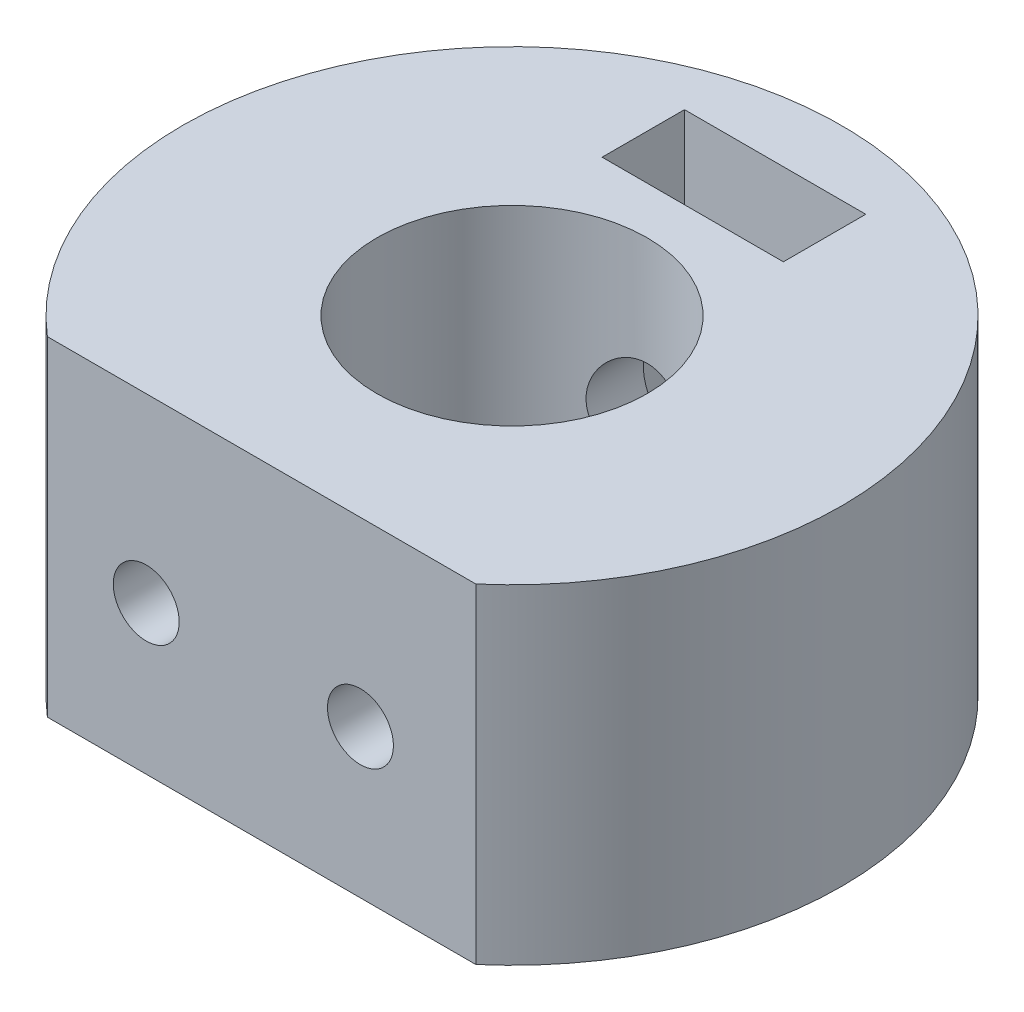
ISO-10303-21;
HEADER;
FILE_DESCRIPTION(('STEP AP214'),'2;1');
FILE_NAME('part.step','',(''),(''),'','','');
FILE_SCHEMA(('AUTOMOTIVE_DESIGN { 1 0 10303 214 1 1 1 1 }'));
ENDSEC;
DATA;
#1=APPLICATION_CONTEXT('core data for automotive mechanical design processes');
#2=APPLICATION_PROTOCOL_DEFINITION('international standard','automotive_design',2000,#1);
#3=PRODUCT_CONTEXT('',#1,'mechanical');
#4=PRODUCT('Part','Part','',(#3));
#5=PRODUCT_RELATED_PRODUCT_CATEGORY('part','',(#4));
#6=PRODUCT_DEFINITION_FORMATION('','',#4);
#7=PRODUCT_DEFINITION_CONTEXT('part definition',#1,'design');
#8=PRODUCT_DEFINITION('design','',#6,#7);
#9=PRODUCT_DEFINITION_SHAPE('','',#8);
#10=(LENGTH_UNIT() NAMED_UNIT(*) SI_UNIT(.MILLI.,.METRE.));
#11=(NAMED_UNIT(*) PLANE_ANGLE_UNIT() SI_UNIT($,.RADIAN.));
#12=(NAMED_UNIT(*) SI_UNIT($,.STERADIAN.) SOLID_ANGLE_UNIT());
#13=UNCERTAINTY_MEASURE_WITH_UNIT(LENGTH_MEASURE(1.E-05),#10,'distance_accuracy_value','');
#14=(GEOMETRIC_REPRESENTATION_CONTEXT(3) GLOBAL_UNCERTAINTY_ASSIGNED_CONTEXT((#13)) GLOBAL_UNIT_ASSIGNED_CONTEXT((#10,
#11,#12)) REPRESENTATION_CONTEXT('',''));
#15=CARTESIAN_POINT('',(0.,0.,0.));
#16=DIRECTION('',(0.,0.,1.));
#17=DIRECTION('',(1.,0.,0.));
#18=AXIS2_PLACEMENT_3D('',#15,#16,#17);
#19=CARTESIAN_POINT('',(0.,5.14875600466311,-13.4006579232147));
#20=DIRECTION('',(0.,0.,1.));
#21=DIRECTION('',(1.,0.,0.));
#22=AXIS2_PLACEMENT_3D('',#19,#20,#21);
#23=CYLINDRICAL_SURFACE('',#22,1.55);
#24=CARTESIAN_POINT('',(0.,5.14875600466311,-8.03281601617198));
#25=DIRECTION('',(0.,0.,-1.));
#26=DIRECTION('',(-1.,0.,0.));
#27=AXIS2_PLACEMENT_3D('',#24,#25,#26);
#28=CIRCLE('',#27,1.55);
#29=CARTESIAN_POINT('',(-1.55,5.14875600466311,-8.03281601617198));
#30=VERTEX_POINT('',#29);
#31=EDGE_CURVE('E44',#30,#30,#28,.F.);
#32=ORIENTED_EDGE('',*,*,#31,.T.);
#33=EDGE_LOOP('',(#32));
#34=FACE_BOUND('',#33,.T.);
#35=CARTESIAN_POINT('',(1.55,5.14875600466311,-9.87914469982093));
#36=CARTESIAN_POINT('',(1.54999645362467,5.2352572468877,-9.87914618258458));
#37=CARTESIAN_POINT('',(1.54273440811201,5.32180784284973,-9.88029309959836));
#38=CARTESIAN_POINT('',(1.51388723108366,5.49248668909826,-9.88475342739521));
#39=CARTESIAN_POINT('',(1.49228834940777,5.57661253295759,-9.88806891796722));
#40=CARTESIAN_POINT('',(1.43543134968755,5.73994676257797,-9.89648205929217));
#41=CARTESIAN_POINT('',(1.4001839837598,5.81915896240165,-9.90157830687782));
#42=CARTESIAN_POINT('',(1.31705631616549,5.97053438714797,-9.91297707939274));
#43=CARTESIAN_POINT('',(1.26917766145408,6.04269852936573,-9.91927944703031));
#44=CARTESIAN_POINT('',(1.16170996479098,6.17855612784661,-9.93244051349818));
#45=CARTESIAN_POINT('',(1.10203425146943,6.24218065703729,-9.93930309477636));
#46=CARTESIAN_POINT('',(0.972853616883496,6.35855525235113,-9.952776744639));
#47=CARTESIAN_POINT('',(0.903348143600153,6.41130470734348,-9.95938779907177));
#48=CARTESIAN_POINT('',(0.756037913891268,6.50468741515583,-9.97165427023862));
#49=CARTESIAN_POINT('',(0.678192333236602,6.54525699337116,-9.97730460003385));
#50=CARTESIAN_POINT('',(0.516689603151229,6.61271951638521,-9.98696992123528));
#51=CARTESIAN_POINT('',(0.433032781493103,6.63961323183558,-9.99098500478707));
#52=CARTESIAN_POINT('',(0.262992845212545,6.6787511107006,-9.99690004710837));
#53=CARTESIAN_POINT('',(0.176636914652342,6.69111081817643,-9.99881667984015));
#54=CARTESIAN_POINT('',(0.00305704492002859,6.70118875752582,-10.0003760558984));
#55=CARTESIAN_POINT('',(-0.0841668425817511,6.69890785582426,-10.0000189337847));
#56=CARTESIAN_POINT('',(-0.256217859315106,6.67986019519255,-9.99708432494727));
#57=CARTESIAN_POINT('',(-0.34105912308796,6.66321775519231,-9.99452589414396));
#58=CARTESIAN_POINT('',(-0.506730060242721,6.61611475521437,-9.98749736431911));
#59=CARTESIAN_POINT('',(-0.587559624683682,6.58565382021178,-9.98302721341493));
#60=CARTESIAN_POINT('',(-0.743287090078505,6.5116523144962,-9.97264484174725));
#61=CARTESIAN_POINT('',(-0.818159877371788,6.46805972975526,-9.96672690419278));
#62=CARTESIAN_POINT('',(-0.959574622311767,6.3690703707002,-9.95410791898241));
#63=CARTESIAN_POINT('',(-1.02611599451366,6.31367276759095,-9.94740681635775));
#64=CARTESIAN_POINT('',(-1.14971236200862,6.19195422311961,-9.93388518275012));
#65=CARTESIAN_POINT('',(-1.20666042688608,6.12552470570579,-9.92706413654105));
#66=CARTESIAN_POINT('',(-1.30861776831814,5.98399602344785,-9.91413984926771));
#67=CARTESIAN_POINT('',(-1.35362696158088,5.90889679812451,-9.90803661321142));
#68=CARTESIAN_POINT('',(-1.43044525434669,5.75204540778367,-9.89723899484108));
#69=CARTESIAN_POINT('',(-1.46224281880505,5.67028750325234,-9.89254584465548));
#70=CARTESIAN_POINT('',(-1.51162477600527,5.50250247834193,-9.88512114472347));
#71=CARTESIAN_POINT('',(-1.52921024202027,5.41647568086316,-9.88238944685331));
#72=CARTESIAN_POINT('',(-1.54952103194361,5.24354778277445,-9.87922520684305));
#73=CARTESIAN_POINT('',(-1.55239818229468,5.15666492971882,-9.87876917533567));
#74=CARTESIAN_POINT('',(-1.5436140348358,4.98365817603287,-9.88014548032674));
#75=CARTESIAN_POINT('',(-1.53195321986441,4.89753425029252,-9.88197774082587));
#76=CARTESIAN_POINT('',(-1.4945531172252,4.72896390024374,-9.88770256652683));
#77=CARTESIAN_POINT('',(-1.46888994441598,4.64650017697418,-9.89158398910683));
#78=CARTESIAN_POINT('',(-1.40429297402282,4.48704451438445,-9.90096056499129));
#79=CARTESIAN_POINT('',(-1.36535848045129,4.41005286229194,-9.90645580292693));
#80=CARTESIAN_POINT('',(-1.27496116413507,4.26304766874283,-9.91849595445214));
#81=CARTESIAN_POINT('',(-1.223400345055,4.1930950600248,-9.9250489348761));
#82=CARTESIAN_POINT('',(-1.10934972840317,4.06278106235098,-9.93844212530365));
#83=CARTESIAN_POINT('',(-1.04685926951799,4.00242025418278,-9.94528235266849));
#84=CARTESIAN_POINT('',(-0.912053439030084,3.89245537345001,-9.95855298637438));
#85=CARTESIAN_POINT('',(-0.839655364514436,3.84295210370248,-9.9649791906104));
#86=CARTESIAN_POINT('',(-0.687482592609691,3.75681090692998,-9.97663181910408));
#87=CARTESIAN_POINT('',(-0.607708108105855,3.72017260876463,-9.98185827797157));
#88=CARTESIAN_POINT('',(-0.443357310318089,3.66096123461213,-9.99050416705174));
#89=CARTESIAN_POINT('',(-0.35880098916595,3.63833373038743,-9.99393058199128));
#90=CARTESIAN_POINT('',(-0.187031586806194,3.60761035421945,-9.99861970055578));
#91=CARTESIAN_POINT('',(-0.0998186939365643,3.59951345455431,-9.99988255720478));
#92=CARTESIAN_POINT('',(0.0738119096710888,3.59810751347846,-10.0001005540474));
#93=CARTESIAN_POINT('',(0.160228382638927,3.60464448866457,-9.99907972416941));
#94=CARTESIAN_POINT('',(0.330717287739155,3.63198981177826,-9.99489367655891));
#95=CARTESIAN_POINT('',(0.414789728900719,3.65279810472504,-9.99172846708774));
#96=CARTESIAN_POINT('',(0.578156970890536,3.70803944949415,-9.98360774650382));
#97=CARTESIAN_POINT('',(0.65745569556334,3.7424611303638,-9.97865372984063));
#98=CARTESIAN_POINT('',(0.809176140334791,3.82393552841412,-9.96749855728621));
#99=CARTESIAN_POINT('',(0.881597606814705,3.87098871117316,-9.96129735542771));
#100=CARTESIAN_POINT('',(1.01828727585299,3.97694411598674,-9.94825909484418));
#101=CARTESIAN_POINT('',(1.08246701171539,4.03595977297811,-9.94141631410424));
#102=CARTESIAN_POINT('',(1.20006782704092,4.16392626636541,-9.92790764809064));
#103=CARTESIAN_POINT('',(1.25348638044348,4.23287942897252,-9.92124180466901));
#104=CARTESIAN_POINT('',(1.3483398600277,4.37925413215469,-9.90879854789034));
#105=CARTESIAN_POINT('',(1.38970057938335,4.45672423178943,-9.9030267343887));
#106=CARTESIAN_POINT('',(1.45876032395204,4.61756641301018,-9.89309082740896));
#107=CARTESIAN_POINT('',(1.48647337433063,4.70093233448287,-9.88892508439638));
#108=CARTESIAN_POINT('',(1.52123960848718,4.84534157516954,-9.88362431840115));
#109=CARTESIAN_POINT('',(1.53200802407374,4.90549781795901,-9.8819534923846));
#110=CARTESIAN_POINT('',(1.54638941992366,5.02667985573188,-9.87971316775383));
#111=CARTESIAN_POINT('',(1.55000250294109,5.08770563821559,-9.87914365332424));
#112=CARTESIAN_POINT('',(1.55,5.14875600466311,-9.87914469982093));
#113=B_SPLINE_CURVE_WITH_KNOTS('',3,(#35,#36,#37,#38,#39,#40,#41,#42,#43,#44,#45,#46,#47,#48,
#49,#50,#51,#52,#53,#54,#55,#56,#57,#58,#59,#60,#61,#62,#63,#64,#65,#66,#67,#68,#69,#70,#71,#72,
#73,#74,#75,#76,#77,#78,#79,#80,#81,#82,#83,#84,#85,#86,#87,#88,#89,#90,#91,#92,#93,#94,#95,#96,
#97,#98,#99,#100,#101,#102,#103,#104,#105,#106,#107,#108,#109,#110,#111,#112),.UNSPECIFIED.,.T.,
.F.,(4,2,2,2,2,2,2,2,2,2,2,2,2,2,2,2,2,2,2,2,2,2,2,2,2,2,2,2,2,2,2,2,2,2,2,2,2,2,4),(0.,
0.259280551263236,0.518810133084237,0.778135675127696,1.03742742120275,1.29870012478935,
1.55998750674059,1.82261798233181,2.08523365673306,2.34574713427059,2.60624519487594,
2.86451065056895,3.1227831158366,3.38209235042215,3.64141979633706,3.90346987715576,
4.16552178612573,4.42780201369479,4.69006243246257,4.94961012446835,5.20914919654077,
5.46729130594808,5.72544695517981,5.98567352057418,6.24591583679814,6.50848061500321,
6.77103781787888,7.03256854883183,7.29408078148741,7.55285422762531,7.81162667683424,
8.07018343427809,8.32874972304823,8.58989337607068,8.85109825823607,9.11387827218121,
9.37638767109772,9.55938388687224,9.7423774747127),.UNSPECIFIED.);
#114=CARTESIAN_POINT('',(1.55,5.14875600466311,-9.87914469982093));
#115=VERTEX_POINT('',#114);
#116=EDGE_CURVE('E154',#115,#115,#113,.T.);
#117=ORIENTED_EDGE('',*,*,#116,.F.);
#118=EDGE_LOOP('',(#117));
#119=FACE_BOUND('',#118,.T.);
#120=ADVANCED_FACE('F39',(#34,#119),#23,.F.);
#121=CARTESIAN_POINT('',(0.,10.,0.));
#122=DIRECTION('',(0.,1.,0.));
#123=DIRECTION('',(0.,0.,1.));
#124=AXIS2_PLACEMENT_3D('',#121,#122,#123);
#125=PLANE('',#124);
#126=DIRECTION('',(0.,0.,1.));
#127=VECTOR('',#126,1.);
#128=CARTESIAN_POINT('',(-2.79914168587239,10.,-8.03281601617198));
#129=LINE('',#128,#127);
#130=CARTESIAN_POINT('',(-2.79914168587239,10.,-8.03281601617198));
#131=VERTEX_POINT('',#130);
#132=CARTESIAN_POINT('',(-2.79914168587239,10.,-5.53281601617198));
#133=VERTEX_POINT('',#132);
#134=EDGE_CURVE('E58',#131,#133,#129,.T.);
#135=ORIENTED_EDGE('',*,*,#134,.F.);
#136=DIRECTION('',(-1.,0.,0.));
#137=VECTOR('',#136,1.);
#138=CARTESIAN_POINT('',(-2.79914168587239,10.,-8.03281601617198));
#139=LINE('',#138,#137);
#140=CARTESIAN_POINT('',(2.7008583141276,10.,-8.03281601617198));
#141=VERTEX_POINT('',#140);
#142=EDGE_CURVE('E126',#141,#131,#139,.T.);
#143=ORIENTED_EDGE('',*,*,#142,.F.);
#144=DIRECTION('',(0.,0.,-1.));
#145=VECTOR('',#144,1.);
#146=CARTESIAN_POINT('',(2.7008583141276,10.,-8.03281601617198));
#147=LINE('',#146,#145);
#148=CARTESIAN_POINT('',(2.70085831412761,10.,-5.53281601617198));
#149=VERTEX_POINT('',#148);
#150=EDGE_CURVE('E130',#149,#141,#147,.T.);
#151=ORIENTED_EDGE('',*,*,#150,.F.);
#152=DIRECTION('',(1.,0.,0.));
#153=VECTOR('',#152,1.);
#154=CARTESIAN_POINT('',(-2.79914168587239,10.,-5.53281601617198));
#155=LINE('',#154,#153);
#156=EDGE_CURVE('E139',#133,#149,#155,.T.);
#157=ORIENTED_EDGE('',*,*,#156,.F.);
#158=EDGE_LOOP('',(#135,#143,#151,#157));
#159=FACE_BOUND('',#158,.T.);
#160=DIRECTION('',(-1.,0.,0.));
#161=VECTOR('',#160,1.);
#162=CARTESIAN_POINT('',(-6.5,10.,7.59934207678533));
#163=LINE('',#162,#161);
#164=CARTESIAN_POINT('',(6.5,10.,7.59934207678533));
#165=VERTEX_POINT('',#164);
#166=CARTESIAN_POINT('',(-6.5,10.,7.59934207678533));
#167=VERTEX_POINT('',#166);
#168=EDGE_CURVE('E209',#165,#167,#163,.T.);
#169=ORIENTED_EDGE('',*,*,#168,.F.);
#170=CARTESIAN_POINT('',(0.,10.,0.));
#171=DIRECTION('',(0.,1.,0.));
#172=DIRECTION('',(0.,0.,1.));
#173=AXIS2_PLACEMENT_3D('',#170,#171,#172);
#174=CIRCLE('',#173,10.);
#175=EDGE_CURVE('E50',#165,#167,#174,.T.);
#176=ORIENTED_EDGE('',*,*,#175,.T.);
#177=EDGE_LOOP('',(#169,#176));
#178=FACE_BOUND('',#177,.T.);
#179=CARTESIAN_POINT('',(0.,10.,0.));
#180=DIRECTION('',(0.,1.,0.));
#181=DIRECTION('',(0.,0.,1.));
#182=AXIS2_PLACEMENT_3D('',#179,#180,#181);
#183=CIRCLE('',#182,4.1);
#184=CARTESIAN_POINT('',(0.,10.,4.1));
#185=VERTEX_POINT('',#184);
#186=EDGE_CURVE('E254',#185,#185,#183,.T.);
#187=ORIENTED_EDGE('',*,*,#186,.F.);
#188=EDGE_LOOP('',(#187));
#189=FACE_BOUND('',#188,.T.);
#190=ADVANCED_FACE('F192',(#159,#178,#189),#125,.T.);
#191=CARTESIAN_POINT('',(0.,0.,0.));
#192=DIRECTION('',(0.,1.,0.));
#193=DIRECTION('',(0.,0.,1.));
#194=AXIS2_PLACEMENT_3D('',#191,#192,#193);
#195=PLANE('',#194);
#196=CARTESIAN_POINT('',(0.,0.,0.));
#197=DIRECTION('',(0.,1.,0.));
#198=DIRECTION('',(0.,0.,1.));
#199=AXIS2_PLACEMENT_3D('',#196,#197,#198);
#200=CIRCLE('',#199,10.);
#201=CARTESIAN_POINT('',(6.5,0.,7.59934207678533));
#202=VERTEX_POINT('',#201);
#203=CARTESIAN_POINT('',(-6.5,0.,7.59934207678533));
#204=VERTEX_POINT('',#203);
#205=EDGE_CURVE('E251',#202,#204,#200,.T.);
#206=ORIENTED_EDGE('',*,*,#205,.F.);
#207=DIRECTION('',(-1.,0.,0.));
#208=VECTOR('',#207,1.);
#209=CARTESIAN_POINT('',(-6.5,0.,7.59934207678533));
#210=LINE('',#209,#208);
#211=EDGE_CURVE('E210',#202,#204,#210,.T.);
#212=ORIENTED_EDGE('',*,*,#211,.T.);
#213=EDGE_LOOP('',(#206,#212));
#214=FACE_BOUND('',#213,.T.);
#215=CARTESIAN_POINT('',(0.,0.,0.));
#216=DIRECTION('',(0.,1.,0.));
#217=DIRECTION('',(0.,0.,1.));
#218=AXIS2_PLACEMENT_3D('',#215,#216,#217);
#219=CIRCLE('',#218,4.1);
#220=CARTESIAN_POINT('',(0.,0.,4.1));
#221=VERTEX_POINT('',#220);
#222=EDGE_CURVE('E256',#221,#221,#219,.T.);
#223=ORIENTED_EDGE('',*,*,#222,.T.);
#224=EDGE_LOOP('',(#223));
#225=FACE_BOUND('',#224,.T.);
#226=ADVANCED_FACE('F231',(#214,#225),#195,.F.);
#227=CARTESIAN_POINT('',(0.,10.,0.));
#228=DIRECTION('',(0.,-1.,0.));
#229=DIRECTION('',(0.,0.,-1.));
#230=AXIS2_PLACEMENT_3D('',#227,#228,#229);
#231=CYLINDRICAL_SURFACE('',#230,10.);
#232=ORIENTED_EDGE('',*,*,#116,.T.);
#233=EDGE_LOOP('',(#232));
#234=FACE_BOUND('',#233,.T.);
#235=ORIENTED_EDGE('',*,*,#175,.F.);
#236=DIRECTION('',(0.,1.,0.));
#237=VECTOR('',#236,1.);
#238=CARTESIAN_POINT('',(6.5,0.,7.59934207678533));
#239=LINE('',#238,#237);
#240=EDGE_CURVE('E245',#202,#165,#239,.T.);
#241=ORIENTED_EDGE('',*,*,#240,.F.);
#242=ORIENTED_EDGE('',*,*,#205,.T.);
#243=DIRECTION('',(0.,1.,0.));
#244=VECTOR('',#243,1.);
#245=CARTESIAN_POINT('',(-6.5,0.,7.59934207678533));
#246=LINE('',#245,#244);
#247=EDGE_CURVE('E247',#204,#167,#246,.T.);
#248=ORIENTED_EDGE('',*,*,#247,.T.);
#249=EDGE_LOOP('',(#235,#241,#242,#248));
#250=FACE_BOUND('',#249,.T.);
#251=ADVANCED_FACE('F41',(#234,#250),#231,.T.);
#252=CARTESIAN_POINT('',(0.,10.,0.));
#253=DIRECTION('',(0.,-1.,0.));
#254=DIRECTION('',(0.,0.,-1.));
#255=AXIS2_PLACEMENT_3D('',#252,#253,#254);
#256=CYLINDRICAL_SURFACE('',#255,4.1);
#257=CARTESIAN_POINT('',(0.,6.69875600466311,-4.1));
#258=CARTESIAN_POINT('',(-0.0838943512846691,6.69875923905769,-4.10000243743328));
#259=CARTESIAN_POINT('',(-0.167766739430126,6.69192357620472,-4.09740273165544));
#260=CARTESIAN_POINT('',(-0.3330023018377,6.66487435768175,-4.08729215383409));
#261=CARTESIAN_POINT('',(-0.414365880182164,6.64466296828227,-4.07978207705381));
#262=CARTESIAN_POINT('',(-0.572176761172013,6.59168105821566,-4.06065609333891));
#263=CARTESIAN_POINT('',(-0.648633305132731,6.55893500569269,-4.04904818893245));
#264=CARTESIAN_POINT('',(-0.794961497224126,6.4819388188153,-4.02288058005055));
#265=CARTESIAN_POINT('',(-0.864831342051565,6.43768554641111,-4.0083200706306));
#266=CARTESIAN_POINT('',(-0.999011534137642,6.33694171346246,-3.97704760339702));
#267=CARTESIAN_POINT('',(-1.06300082618012,6.2800428370583,-3.96027407430724));
#268=CARTESIAN_POINT('',(-1.18078859709458,6.15648974859299,-3.92676650052628));
#269=CARTESIAN_POINT('',(-1.23458388228106,6.08983249087878,-3.91003246982574));
#270=CARTESIAN_POINT('',(-1.33251496020645,5.94549835019705,-3.87777902420789));
#271=CARTESIAN_POINT('',(-1.37619436581391,5.86749399525361,-3.86233203988292));
#272=CARTESIAN_POINT('',(-1.44967106781251,5.70457070329104,-3.83536141660572));
#273=CARTESIAN_POINT('',(-1.47947401209063,5.61965459600039,-3.82383618196916));
#274=CARTESIAN_POINT('',(-1.52307959743078,5.44901622625332,-3.80667312657512));
#275=CARTESIAN_POINT('',(-1.53749566573519,5.36347409760198,-3.80081055671647));
#276=CARTESIAN_POINT('',(-1.55183610401334,5.19099943073895,-3.79497967282934));
#277=CARTESIAN_POINT('',(-1.5517665850613,5.10406749432637,-3.79500887322351));
#278=CARTESIAN_POINT('',(-1.53760637548894,4.9369261195281,-3.80076469697355));
#279=CARTESIAN_POINT('',(-1.52437099689235,4.85663001661291,-3.80614376563804));
#280=CARTESIAN_POINT('',(-1.4856701931533,4.6994967790763,-3.82141495589786));
#281=CARTESIAN_POINT('',(-1.46020289535697,4.62266017606003,-3.83130776851624));
#282=CARTESIAN_POINT('',(-1.39729809692756,4.4728990270668,-3.85469823063764));
#283=CARTESIAN_POINT('',(-1.3596411340275,4.40007730818528,-3.86826115936064));
#284=CARTESIAN_POINT('',(-1.27357905094833,4.26154000378632,-3.89744237957821));
#285=CARTESIAN_POINT('',(-1.2251701774832,4.19582691169545,-3.91306138803342));
#286=CARTESIAN_POINT('',(-1.11508076909494,4.06864398710125,-3.9458977699589));
#287=CARTESIAN_POINT('',(-1.05271897993601,4.00777174945865,-3.96315140065604));
#288=CARTESIAN_POINT('',(-0.91847548947379,3.89717001764247,-3.99639584540032));
#289=CARTESIAN_POINT('',(-0.846592279764305,3.84744229237638,-4.01238645871515));
#290=CARTESIAN_POINT('',(-0.693801913790221,3.75986758218085,-4.04163036266799));
#291=CARTESIAN_POINT('',(-0.612769144739964,3.72222268210933,-4.05483594034379));
#292=CARTESIAN_POINT('',(-0.444896962401879,3.66129852186587,-4.07666714468414));
#293=CARTESIAN_POINT('',(-0.358060191694171,3.63801277265071,-4.08529483989303));
#294=CARTESIAN_POINT('',(-0.186072033581473,3.60762385999009,-4.09663296264648));
#295=CARTESIAN_POINT('',(-0.101082047503284,3.59971616852295,-4.09963724254032));
#296=CARTESIAN_POINT('',(0.0690539317519815,3.59796129658327,-4.10030020858345));
#297=CARTESIAN_POINT('',(0.154199885319,3.60411093800727,-4.09796010299974));
#298=CARTESIAN_POINT('',(0.318734009761935,3.62968695371159,-4.08839095063739));
#299=CARTESIAN_POINT('',(0.398217061819333,3.6485836521834,-4.08135706444515));
#300=CARTESIAN_POINT('',(0.552826500253616,3.69841719061729,-4.06330475450153));
#301=CARTESIAN_POINT('',(0.627952318895834,3.72935559554676,-4.05228581285652));
#302=CARTESIAN_POINT('',(0.774204420384254,3.80338476431835,-4.02694443539983));
#303=CARTESIAN_POINT('',(0.845146844857686,3.84680770298724,-4.01253398046624));
#304=CARTESIAN_POINT('',(0.978977509639574,3.94419870228309,-3.98199979863894));
#305=CARTESIAN_POINT('',(1.04186272809454,3.99817070027806,-3.96587543306745));
#306=CARTESIAN_POINT('',(1.16167484261683,4.1188721652325,-3.93250637601045));
#307=CARTESIAN_POINT('',(1.21803156606236,4.18616631648715,-3.91525169832109));
#308=CARTESIAN_POINT('',(1.31876844152222,4.32959214044888,-3.88248167257978));
#309=CARTESIAN_POINT('',(1.36314742225973,4.40572467640164,-3.8669664947163));
#310=CARTESIAN_POINT('',(1.43873934212805,4.56535200055504,-3.83948733828779));
#311=CARTESIAN_POINT('',(1.46988881310534,4.64888000660701,-3.82754055842436));
#312=CARTESIAN_POINT('',(1.5174714371354,4.82057478912277,-3.80892974655599));
#313=CARTESIAN_POINT('',(1.53391389835403,4.90873859408938,-3.80226237348588));
#314=CARTESIAN_POINT('',(1.55077683265221,5.08101276289544,-3.79541383689876));
#315=CARTESIAN_POINT('',(1.5521716320241,5.16501284292414,-3.79483828163591));
#316=CARTESIAN_POINT('',(1.54140329331877,5.33198395695133,-3.79922480615835));
#317=CARTESIAN_POINT('',(1.52924148495932,5.41495509106825,-3.80418634283074));
#318=CARTESIAN_POINT('',(1.49246840045262,5.57485447350581,-3.81875733841023));
#319=CARTESIAN_POINT('',(1.46826173800914,5.65189076849212,-3.82821531907827));
#320=CARTESIAN_POINT('',(1.40844504756193,5.80085198484378,-3.8506230090803));
#321=CARTESIAN_POINT('',(1.37283211481095,5.87277559849452,-3.86357360771963));
#322=CARTESIAN_POINT('',(1.28902315477119,6.01361792883359,-3.8923616118096));
#323=CARTESIAN_POINT('',(1.24025997413653,6.08217500723694,-3.9083156889544));
#324=CARTESIAN_POINT('',(1.13240673798489,6.2104441861762,-3.94091692776105));
#325=CARTESIAN_POINT('',(1.07331337319937,6.27015344095716,-3.95756431021708));
#326=CARTESIAN_POINT('',(0.942568382337528,6.38240459163513,-3.99078350119484));
#327=CARTESIAN_POINT('',(0.870402642997494,6.43436672562142,-4.00730010841776));
#328=CARTESIAN_POINT('',(0.717782014632402,6.52541301877529,-4.03742919046351));
#329=CARTESIAN_POINT('',(0.637326249829256,6.56449581550419,-4.05104135798699));
#330=CARTESIAN_POINT('',(0.46609535908563,6.629993948422,-4.07438029700371));
#331=CARTESIAN_POINT('',(0.375004941384468,6.65567480217493,-4.08387769127909));
#332=CARTESIAN_POINT('',(0.189265778033309,6.69004956304372,-4.0966845496929));
#333=CARTESIAN_POINT('',(0.0946189203499629,6.69875235680221,-4.09999725097933));
#334=CARTESIAN_POINT('',(0.,6.69875600466311,-4.1));
#335=B_SPLINE_CURVE_WITH_KNOTS('',3,(#257,#258,#259,#260,#261,#262,#263,#264,#265,#266,#267,
#268,#269,#270,#271,#272,#273,#274,#275,#276,#277,#278,#279,#280,#281,#282,#283,#284,#285,#286,
#287,#288,#289,#290,#291,#292,#293,#294,#295,#296,#297,#298,#299,#300,#301,#302,#303,#304,#305,
#306,#307,#308,#309,#310,#311,#312,#313,#314,#315,#316,#317,#318,#319,#320,#321,#322,#323,#324,
#325,#326,#327,#328,#329,#330,#331,#332,#333,#334),.UNSPECIFIED.,.T.,.F.,(4,2,2,2,2,2,2,2,2,2,2,
2,2,2,2,2,2,2,2,2,2,2,2,2,2,2,2,2,2,2,2,2,2,2,2,2,2,2,4),(0.,0.251333999645528,
0.502627304362531,0.753432555988191,1.00430627473946,1.26491759097889,1.52561041976896,
1.79642968462744,2.06713862621801,2.32659827968793,2.58594847442755,2.82948270929026,
3.0730542400799,3.32128069186443,3.56959393131837,3.83489016864015,4.10022848520601,
4.36979769070274,4.63924498574402,4.8941703202311,5.1490380265066,5.39391902925968,
5.63883186793405,5.89098397135075,6.14323036924953,6.41035417871906,6.67750410017548,
6.94592157117548,7.2141690384898,7.46493469122984,7.71567574945368,7.95851110463878,
8.20140835007488,8.45718703918545,8.7130478175117,8.98307275516674,9.25312624820504,
9.53673782158786,9.82020090735635),.UNSPECIFIED.);
#336=CARTESIAN_POINT('',(0.,6.69875600466311,-4.1));
#337=VERTEX_POINT('',#336);
#338=EDGE_CURVE('E163',#337,#337,#335,.T.);
#339=ORIENTED_EDGE('',*,*,#338,.F.);
#340=EDGE_LOOP('',(#339));
#341=FACE_BOUND('',#340,.T.);
#342=CARTESIAN_POINT('',(-4.05595723288531,5.33121089694644,0.599342076785332));
#343=CARTESIAN_POINT('',(-4.03928083626046,5.3423108878178,0.712128246015264));
#344=CARTESIAN_POINT('',(-4.01796621898889,5.35590601971469,0.823907413372381));
#345=CARTESIAN_POINT('',(-3.96615618831719,5.38521521762557,1.04526071809343));
#346=CARTESIAN_POINT('',(-3.93564422889273,5.40093307405577,1.15483049855118));
#347=CARTESIAN_POINT('',(-3.86521103373738,5.43172371620132,1.37235344511336));
#348=CARTESIAN_POINT('',(-3.82518993067154,5.44678749778621,1.48027554412933));
#349=CARTESIAN_POINT('',(-3.73604701590869,5.47285129264669,1.69268772186));
#350=CARTESIAN_POINT('',(-3.68693721089891,5.48385661063668,1.7971821168164));
#351=CARTESIAN_POINT('',(-3.58330216693169,5.49780503417106,1.99539969861646));
#352=CARTESIAN_POINT('',(-3.52934175185633,5.50122867468472,2.08938023520046));
#353=CARTESIAN_POINT('',(-3.41428741338948,5.49797675427489,2.27250173430187));
#354=CARTESIAN_POINT('',(-3.35321374091556,5.49132924638329,2.36165542610539));
#355=CARTESIAN_POINT('',(-3.23601593935673,5.46606383538569,2.51916088427011));
#356=CARTESIAN_POINT('',(-3.18077039194322,5.4496320992043,2.58849907664683));
#357=CARTESIAN_POINT('',(-3.06812554864119,5.40397053664751,2.72104889934304));
#358=CARTESIAN_POINT('',(-3.01072990436508,5.37476158298927,2.78427031712084));
#359=CARTESIAN_POINT('',(-2.91471237966772,5.31217760665802,2.88404014301475));
#360=CARTESIAN_POINT('',(-2.87575713473139,5.28286218668648,2.92280331101056));
#361=CARTESIAN_POINT('',(-2.80017276907108,5.21608357667803,2.99528926727937));
#362=CARTESIAN_POINT('',(-2.76354083766363,5.1786304840281,3.02901821539073));
#363=CARTESIAN_POINT('',(-2.70041916328675,5.10225166352991,3.08532507462319));
#364=CARTESIAN_POINT('',(-2.67325086612353,5.0645711882339,3.10882455669563));
#365=CARTESIAN_POINT('',(-2.62352129799547,4.98376794662531,3.150904242805));
#366=CARTESIAN_POINT('',(-2.6009587869755,4.94064665026411,3.16948577134517));
#367=CARTESIAN_POINT('',(-2.56176898024192,4.84956269895565,3.20124747484257));
#368=CARTESIAN_POINT('',(-2.545178858836,4.80157202600062,3.21439389236812));
#369=CARTESIAN_POINT('',(-2.51936732453044,4.70243048216059,3.23466588025018));
#370=CARTESIAN_POINT('',(-2.51014229421416,4.65128117597703,3.24179440643548));
#371=CARTESIAN_POINT('',(-2.50035337724673,4.5534248621718,3.24934834335832));
#372=CARTESIAN_POINT('',(-2.49894625147506,4.50685030842444,3.25042649566531));
#373=CARTESIAN_POINT('',(-2.50261579230069,4.41411971964311,3.24760221545317));
#374=CARTESIAN_POINT('',(-2.5076903692606,4.36796355455516,3.24370138810854));
#375=CARTESIAN_POINT('',(-2.5236889198554,4.27914091462161,3.23126755605937));
#376=CARTESIAN_POINT('',(-2.53438879734925,4.23640850105664,3.22291185239485));
#377=CARTESIAN_POINT('',(-2.56087801902494,4.15368044035249,3.20190379298012));
#378=CARTESIAN_POINT('',(-2.57666761412679,4.11368492825878,3.18925122539548));
#379=CARTESIAN_POINT('',(-2.61338505772376,4.03537740439527,3.15924105108884));
#380=CARTESIAN_POINT('',(-2.63452575710271,3.99724233829295,3.14168425329886));
#381=CARTESIAN_POINT('',(-2.68041956256475,3.92545049651057,3.10262165307425));
#382=CARTESIAN_POINT('',(-2.70517450427581,3.89179601316704,3.0811138425283));
#383=CARTESIAN_POINT('',(-2.76727624762396,3.81714335994338,3.02564091961331));
#384=CARTESIAN_POINT('',(-2.80579952625655,3.77831229571221,2.99006906622737));
#385=CARTESIAN_POINT('',(-2.88525750284716,3.70951431870167,2.91347816928482));
#386=CARTESIAN_POINT('',(-2.92619649190178,3.67956378596256,2.87244925961186));
#387=CARTESIAN_POINT('',(-3.02496122503874,3.6174075375462,2.76885058535789));
#388=CARTESIAN_POINT('',(-3.08302007076719,3.58905256671988,2.70420877721711));
#389=CARTESIAN_POINT('',(-3.19670370663323,3.54514942719689,2.56884246643989));
#390=CARTESIAN_POINT('',(-3.25232490278472,3.52961960325516,2.49810941007204));
#391=CARTESIAN_POINT('',(-3.34871387993319,3.51054631510128,2.36672397651989));
#392=CARTESIAN_POINT('',(-3.39023815870827,3.50523522309017,2.30685838514365));
#393=CARTESIAN_POINT('',(-3.47014310029856,3.49964407699185,2.18481936270777));
#394=CARTESIAN_POINT('',(-3.50852176855852,3.49936719077742,2.12264450314891));
#395=CARTESIAN_POINT('',(-3.61882573903122,3.50434389152917,1.93275961130874));
#396=CARTESIAN_POINT('',(-3.68557088923141,3.51545352622078,1.8021637284677));
#397=CARTESIAN_POINT('',(-3.78320897950063,3.54013597599753,1.58309613147095));
#398=CARTESIAN_POINT('',(-3.81840624321707,3.55142386393305,1.49617963011509));
#399=CARTESIAN_POINT('',(-3.88273245370655,3.57550258500064,1.32028318060439));
#400=CARTESIAN_POINT('',(-3.91185966187504,3.58829384709767,1.23130264935137));
#401=CARTESIAN_POINT('',(-3.96363702729861,3.61351105840794,1.05267483807719));
#402=CARTESIAN_POINT('',(-3.98636469545631,3.62593958364098,0.963050352080058));
#403=CARTESIAN_POINT('',(-4.02573912493569,3.64905436871828,0.782284108059318));
#404=CARTESIAN_POINT('',(-4.04238745249635,3.65974107691878,0.691142747168573));
#405=CARTESIAN_POINT('',(-4.05595723288539,3.66878910305014,0.599342076784982));
#406=B_SPLINE_CURVE_WITH_KNOTS('',3,(#342,#343,#344,#345,#346,#347,#348,#349,#350,#351,#352,
#353,#354,#355,#356,#357,#358,#359,#360,#361,#362,#363,#364,#365,#366,#367,#368,#369,#370,#371,
#372,#373,#374,#375,#376,#377,#378,#379,#380,#381,#382,#383,#384,#385,#386,#387,#388,#389,#390,
#391,#392,#393,#394,#395,#396,#397,#398,#399,#400,#401,#402,#403,#404,#405),.UNSPECIFIED.,.F.,
.F.,(4,2,2,2,2,2,2,2,2,2,2,2,2,2,2,2,2,2,2,2,2,2,2,2,2,2,2,2,2,2,2,4),(0.,0.343434387374693,
0.687490338634889,1.03533315931902,1.38271969835992,1.70736943834292,2.03111653252363,
2.30075865644337,2.56996193147653,2.75618288730875,2.94217408276236,3.0977114000244,
3.25320678525303,3.40965394555063,3.56602421836479,3.70514336855639,3.84421767941631,
3.97813012580647,4.11204917500918,4.25249253587506,4.39300747589167,4.58766595940325,
4.78268128611971,5.05534905384265,5.32840616618286,5.54724992909769,5.76623139898157,
6.20594606983724,6.48912044141848,6.77237580956341,7.05203628900858,7.33162466775743),.UNSPECIFIED.);
#407=CARTESIAN_POINT('',(-4.05595723288531,5.33121089694644,0.599342076785332));
#408=VERTEX_POINT('',#407);
#409=CARTESIAN_POINT('',(-4.05595723288531,3.66878910305356,0.599342076785332));
#410=VERTEX_POINT('',#409);
#411=EDGE_CURVE('E202',#408,#410,#406,.T.);
#412=ORIENTED_EDGE('',*,*,#411,.F.);
#413=DIRECTION('',(0.,-1.,0.));
#414=VECTOR('',#413,1.);
#415=CARTESIAN_POINT('',(-4.05595723288531,10.,0.599342076785332));
#416=LINE('',#415,#414);
#417=EDGE_CURVE('E11',#408,#410,#416,.T.);
#418=ORIENTED_EDGE('',*,*,#417,.T.);
#419=EDGE_LOOP('',(#412,#418));
#420=FACE_BOUND('',#419,.T.);
#421=CARTESIAN_POINT('',(4.,4.5,0.899999999999995));
#422=CARTESIAN_POINT('',(4.00000028865516,4.4861923327866,0.899998509921344));
#423=CARTESIAN_POINT('',(3.99971069289262,4.47238766367499,0.901288575352129));
#424=CARTESIAN_POINT('',(3.99859182177978,4.44522870719984,0.906239265105096));
#425=CARTESIAN_POINT('',(3.99776166576915,4.43187519224737,0.909903757706332));
#426=CARTESIAN_POINT('',(3.99524542274188,4.4009489315498,0.920899447480652));
#427=CARTESIAN_POINT('',(3.99335369567961,4.38370804566646,0.929095860988006));
#428=CARTESIAN_POINT('',(3.98893199559888,4.3506917882103,0.947900448437088));
#429=CARTESIAN_POINT('',(3.98640008752859,4.33492106187764,0.958515924610042));
#430=CARTESIAN_POINT('',(3.97996362872041,4.29978650979052,0.984950730370782));
#431=CARTESIAN_POINT('',(3.97587946732494,4.28089735015548,1.00134592129111));
#432=CARTESIAN_POINT('',(3.96706085332405,4.24477902190939,1.03573509766754));
#433=CARTESIAN_POINT('',(3.96232503469488,4.2275534732179,1.05373241280263));
#434=CARTESIAN_POINT('',(3.94724828037946,4.17759839799717,1.10937049171215));
#435=CARTESIAN_POINT('',(3.93607804161567,4.14678580736629,1.14848846396898));
#436=CARTESIAN_POINT('',(3.90536240035079,4.0725825776958,1.24991189953917));
#437=CARTESIAN_POINT('',(3.88454612235513,4.03135364672701,1.31336041692766));
#438=CARTESIAN_POINT('',(3.83875228674888,3.95363772078747,1.44175514931345));
#439=CARTESIAN_POINT('',(3.81376718386813,3.91715954143965,1.5067038925651));
#440=CARTESIAN_POINT('',(3.75966014924826,3.8482043067193,1.63705157368033));
#441=CARTESIAN_POINT('',(3.73053587577796,3.81572953582592,1.70245074630714));
#442=CARTESIAN_POINT('',(3.66814175112146,3.75468979098766,1.83302225903662));
#443=CARTESIAN_POINT('',(3.63487517913556,3.7261217614427,1.89819473710864));
#444=CARTESIAN_POINT('',(3.56249878104322,3.67191079937233,2.03090432249215));
#445=CARTESIAN_POINT('',(3.52319140639467,3.64646118556776,2.09841339573168));
#446=CARTESIAN_POINT('',(3.43989093863762,3.60069187326659,2.23234684456324));
#447=CARTESIAN_POINT('',(3.39589530600688,3.58037497533468,2.29877060957159));
#448=CARTESIAN_POINT('',(3.30348458177981,3.54589403458335,2.42968677872945));
#449=CARTESIAN_POINT('',(3.25509048322527,3.53170244947094,2.49418658818568));
#450=CARTESIAN_POINT('',(3.15397663037823,3.51057844275289,2.62087536187332));
#451=CARTESIAN_POINT('',(3.10126192330548,3.50363767768461,2.68306690252266));
#452=CARTESIAN_POINT('',(2.99052936931386,3.49846931157394,2.8060207434264));
#453=CARTESIAN_POINT('',(2.93240841133601,3.5004760292609,2.86670225004034));
#454=CARTESIAN_POINT('',(2.81326240253822,3.51576070787566,2.98370516699674));
#455=CARTESIAN_POINT('',(2.75223995999001,3.52902871982533,3.0400303780699));
#456=CARTESIAN_POINT('',(2.64014108180513,3.56547227331253,3.13754384295601));
#457=CARTESIAN_POINT('',(2.58918729641349,3.58651483442649,3.17965834726199));
#458=CARTESIAN_POINT('',(2.48864254044664,3.63877329735742,3.25894741706057));
#459=CARTESIAN_POINT('',(2.43904997987109,3.66997672990915,3.2961279591175));
#460=CARTESIAN_POINT('',(2.35195711394447,3.73677431199969,3.35867085403506));
#461=CARTESIAN_POINT('',(2.31384378018312,3.77069107050506,3.38496604620691));
#462=CARTESIAN_POINT('',(2.24199058903612,3.84569567647881,3.43297889365594));
#463=CARTESIAN_POINT('',(2.20824954399192,3.8867815694271,3.45469779301366));
#464=CARTESIAN_POINT('',(2.1467668416506,3.97566448472247,3.49323948272878));
#465=CARTESIAN_POINT('',(2.1190582097855,4.02349619910069,3.51003548712436));
#466=CARTESIAN_POINT('',(2.07154638376913,4.12439567036676,3.53828581198138));
#467=CARTESIAN_POINT('',(2.05174041253669,4.17746157971103,3.54974200914778));
#468=CARTESIAN_POINT('',(2.02279175143663,4.2816094972998,3.56630960005025));
#469=CARTESIAN_POINT('',(2.01279174686882,4.3323731321781,3.57193428849718));
#470=CARTESIAN_POINT('',(2.00076861285504,4.43512405582157,3.5786833941747));
#471=CARTESIAN_POINT('',(1.9987426114558,4.48711089724344,3.57980943166209));
#472=CARTESIAN_POINT('',(2.00267367243341,4.58818233008194,3.57761105007475));
#473=CARTESIAN_POINT('',(2.00825360894402,4.63728682374227,3.57449688172557));
#474=CARTESIAN_POINT('',(2.02645975493038,4.73372320036921,3.56420664757344));
#475=CARTESIAN_POINT('',(2.03908522756721,4.78105526814805,3.55703100652785));
#476=CARTESIAN_POINT('',(2.07082723875788,4.87283244761847,3.53864510668861));
#477=CARTESIAN_POINT('',(2.08996537786636,4.91726735823679,3.52742141421319));
#478=CARTESIAN_POINT('',(2.13382607879319,5.00201671700358,3.50106247179963));
#479=CARTESIAN_POINT('',(2.15854938266025,5.04233061659707,3.48592670206176));
#480=CARTESIAN_POINT('',(2.2138476982691,5.1199577003345,3.45108604951123));
#481=CARTESIAN_POINT('',(2.24465343097151,5.15702018082229,3.4311906012576));
#482=CARTESIAN_POINT('',(2.30988536074438,5.22523952628166,3.38761988136488));
#483=CARTESIAN_POINT('',(2.34431260474288,5.25639467619198,3.3639435156852));
#484=CARTESIAN_POINT('',(2.41941224783886,5.31575306524057,3.31040642394572));
#485=CARTESIAN_POINT('',(2.46035525745309,5.34325619527394,3.28015205999071));
#486=CARTESIAN_POINT('',(2.54358344804757,5.39106266376406,3.21604663232591));
#487=CARTESIAN_POINT('',(2.58586957621841,5.41136079253562,3.18219298899393));
#488=CARTESIAN_POINT('',(2.69229532647338,5.4539811128591,3.09329481065991));
#489=CARTESIAN_POINT('',(2.75652435845016,5.47200589445648,3.03628419733946));
#490=CARTESIAN_POINT('',(2.88240086748245,5.49513036540733,2.91707808935055));
#491=CARTESIAN_POINT('',(2.94404324879243,5.50020562096016,2.85487302147422));
#492=CARTESIAN_POINT('',(3.08846629988845,5.49969128329109,2.69942101241535));
#493=CARTESIAN_POINT('',(3.16909984658665,5.48865397350393,2.60421478907062));
#494=CARTESIAN_POINT('',(3.32010512269335,5.45059295246712,2.40879024745176));
#495=CARTESIAN_POINT('',(3.39044176589114,5.42351609909434,2.308556286436));
#496=CARTESIAN_POINT('',(3.50077659800229,5.36707469611003,2.13581224873774));
#497=CARTESIAN_POINT('',(3.54354748810709,5.34083108566236,2.06400206483715));
#498=CARTESIAN_POINT('',(3.62383348180549,5.28312139857929,1.9195453532504));
#499=CARTESIAN_POINT('',(3.66134859449537,5.25165533098273,1.84689882701196));
#500=CARTESIAN_POINT('',(3.73108682769568,5.1840060567695,1.7016076986874));
#501=CARTESIAN_POINT('',(3.763325920385,5.14783770531824,1.62896378236052));
#502=CARTESIAN_POINT('',(3.82269806528863,5.07057432906701,1.48427249925497));
#503=CARTESIAN_POINT('',(3.84983649501491,5.02948456850339,1.41222458163941));
#504=CARTESIAN_POINT('',(3.88595395652882,4.96437831307757,1.30790568330505));
#505=CARTESIAN_POINT('',(3.89694015924272,4.94284042580686,1.27477091175512));
#506=CARTESIAN_POINT('',(3.91776012421335,4.89791096104066,1.20927004270307));
#507=CARTESIAN_POINT('',(3.92759135533791,4.87451549385138,1.17690575299156));
#508=CARTESIAN_POINT('',(3.94626988841783,4.82451590450669,1.11270345706143));
#509=CARTESIAN_POINT('',(3.95507628251279,4.79783375211452,1.08091439688272));
#510=CARTESIAN_POINT('',(3.97108058763512,4.74060809633057,1.02052261597401));
#511=CARTESIAN_POINT('',(3.97828595445339,4.71008357467073,0.991905450530767));
#512=CARTESIAN_POINT('',(3.9867011661675,4.66309648743885,0.957247605094086));
#513=CARTESIAN_POINT('',(3.98890807119235,4.64923921394359,0.947991245424572));
#514=CARTESIAN_POINT('',(3.99283508316476,4.62037916311091,0.93131081154394));
#515=CARTESIAN_POINT('',(3.99455561225435,4.60537739357237,0.923885149129552));
#516=CARTESIAN_POINT('',(3.99724512150441,4.57554163827617,0.912176162836977));
#517=CARTESIAN_POINT('',(3.99826476007529,4.56079773639146,0.907682636918291));
#518=CARTESIAN_POINT('',(3.99964117797615,4.53070019451468,0.901599154706311));
#519=CARTESIAN_POINT('',(3.99999967913841,4.51534824503463,0.900001656332806));
#520=CARTESIAN_POINT('',(4.,4.5,0.899999999999995));
#521=B_SPLINE_CURVE_WITH_KNOTS('',3,(#421,#422,#423,#424,#425,#426,#427,#428,#429,#430,#431,
#432,#433,#434,#435,#436,#437,#438,#439,#440,#441,#442,#443,#444,#445,#446,#447,#448,#449,#450,
#451,#452,#453,#454,#455,#456,#457,#458,#459,#460,#461,#462,#463,#464,#465,#466,#467,#468,#469,
#470,#471,#472,#473,#474,#475,#476,#477,#478,#479,#480,#481,#482,#483,#484,#485,#486,#487,#488,
#489,#490,#491,#492,#493,#494,#495,#496,#497,#498,#499,#500,#501,#502,#503,#504,#505,#506,#507,
#508,#509,#510,#511,#512,#513,#514,#515,#516,#517,#518,#519,#520),.UNSPECIFIED.,.T.,.F.,(4,2,2,
2,2,2,2,2,2,2,2,2,2,2,2,2,2,2,2,2,2,2,2,2,2,2,2,2,2,2,2,2,2,2,2,2,2,2,2,2,2,2,2,2,2,2,2,2,2,4),
(0.,0.0413609037405141,0.0827893602644631,0.140008853285291,0.197403413537504,0.273248131704721,
0.349254331160588,0.502043223184089,0.737108064437556,0.972603065149406,1.20823183121565,
1.44367523659781,1.68987745904497,1.93621372812458,2.18143051223686,2.4263648154374,
2.67775064816534,2.92891462078621,3.13624871404666,3.34332932296655,3.51480486541586,
3.68623373134767,3.8585787432145,4.03086313771097,4.18619932306522,4.34147955670957,
4.4893341157464,4.63717321469872,4.7855075093991,4.93386152349523,5.08963077259237,
5.24544517679065,5.41837407251639,5.59142775360229,5.85320195497854,6.1154697207144,
6.48917393300908,6.86412328011586,7.12663408883863,7.38914444322261,7.65084477560808,
7.91226763639755,8.03528137712883,8.15855986414991,8.2857338457276,8.41230256729767,
8.46263019073296,8.51291399807045,8.55900992708719,8.60498563577513),.UNSPECIFIED.);
#522=CARTESIAN_POINT('',(4.,4.5,0.899999999999995));
#523=VERTEX_POINT('',#522);
#524=EDGE_CURVE('E196',#523,#523,#521,.T.);
#525=ORIENTED_EDGE('',*,*,#524,.F.);
#526=EDGE_LOOP('',(#525));
#527=FACE_BOUND('',#526,.T.);
#528=ORIENTED_EDGE('',*,*,#186,.T.);
#529=EDGE_LOOP('',(#528));
#530=FACE_BOUND('',#529,.T.);
#531=ORIENTED_EDGE('',*,*,#222,.F.);
#532=EDGE_LOOP('',(#531));
#533=FACE_BOUND('',#532,.T.);
#534=ADVANCED_FACE('F184',(#341,#420,#527,#530,#533),#256,.F.);
#535=CARTESIAN_POINT('',(-6.5,0.,7.59934207678533));
#536=DIRECTION('',(0.,0.,-1.));
#537=DIRECTION('',(-1.,0.,0.));
#538=AXIS2_PLACEMENT_3D('',#535,#536,#537);
#539=PLANE('',#538);
#540=CARTESIAN_POINT('',(-3.5,4.5,7.59934207678533));
#541=DIRECTION('',(0.,0.,1.));
#542=DIRECTION('',(1.,0.,0.));
#543=AXIS2_PLACEMENT_3D('',#540,#541,#542);
#544=CIRCLE('',#543,1.);
#545=CARTESIAN_POINT('',(-2.5,4.5,7.59934207678533));
#546=VERTEX_POINT('',#545);
#547=EDGE_CURVE('E391',#546,#546,#544,.T.);
#548=ORIENTED_EDGE('',*,*,#547,.F.);
#549=EDGE_LOOP('',(#548));
#550=FACE_BOUND('',#549,.T.);
#551=CARTESIAN_POINT('',(3.,4.5,7.59934207678533));
#552=DIRECTION('',(0.,0.,1.));
#553=DIRECTION('',(1.,0.,0.));
#554=AXIS2_PLACEMENT_3D('',#551,#552,#553);
#555=CIRCLE('',#554,1.);
#556=CARTESIAN_POINT('',(4.,4.5,7.59934207678533));
#557=VERTEX_POINT('',#556);
#558=EDGE_CURVE('E162',#557,#557,#555,.T.);
#559=ORIENTED_EDGE('',*,*,#558,.F.);
#560=EDGE_LOOP('',(#559));
#561=FACE_BOUND('',#560,.T.);
#562=ORIENTED_EDGE('',*,*,#168,.T.);
#563=ORIENTED_EDGE('',*,*,#247,.F.);
#564=ORIENTED_EDGE('',*,*,#211,.F.);
#565=ORIENTED_EDGE('',*,*,#240,.T.);
#566=EDGE_LOOP('',(#562,#563,#564,#565));
#567=FACE_BOUND('',#566,.T.);
#568=ADVANCED_FACE('F189',(#550,#561,#567),#539,.F.);
#569=CARTESIAN_POINT('',(3.,4.5,0.599342076785332));
#570=DIRECTION('',(0.,0.,1.));
#571=DIRECTION('',(1.,0.,0.));
#572=AXIS2_PLACEMENT_3D('',#569,#570,#571);
#573=CYLINDRICAL_SURFACE('',#572,1.);
#574=ORIENTED_EDGE('',*,*,#524,.T.);
#575=EDGE_LOOP('',(#574));
#576=FACE_BOUND('',#575,.T.);
#577=ORIENTED_EDGE('',*,*,#558,.T.);
#578=EDGE_LOOP('',(#577));
#579=FACE_BOUND('',#578,.T.);
#580=ADVANCED_FACE('F215',(#576,#579),#573,.F.);
#581=CARTESIAN_POINT('',(-3.5,4.5,0.599342076785332));
#582=DIRECTION('',(0.,0.,1.));
#583=DIRECTION('',(1.,0.,0.));
#584=AXIS2_PLACEMENT_3D('',#581,#582,#583);
#585=CYLINDRICAL_SURFACE('',#584,1.);
#586=ORIENTED_EDGE('',*,*,#411,.T.);
#587=CARTESIAN_POINT('',(-3.5,4.5,0.599342076785332));
#588=DIRECTION('',(0.,0.,1.));
#589=DIRECTION('',(1.,0.,0.));
#590=AXIS2_PLACEMENT_3D('',#587,#588,#589);
#591=CIRCLE('',#590,1.);
#592=EDGE_CURVE('E65',#408,#410,#591,.T.);
#593=ORIENTED_EDGE('',*,*,#592,.F.);
#594=EDGE_LOOP('',(#586,#593));
#595=FACE_BOUND('',#594,.T.);
#596=ORIENTED_EDGE('',*,*,#547,.T.);
#597=EDGE_LOOP('',(#596));
#598=FACE_BOUND('',#597,.T.);
#599=ADVANCED_FACE('F212',(#595,#598),#585,.F.);
#600=CARTESIAN_POINT('',(-3.5,4.5,0.599342076785332));
#601=DIRECTION('',(0.,0.,1.));
#602=DIRECTION('',(1.,0.,0.));
#603=AXIS2_PLACEMENT_3D('',#600,#601,#602);
#604=PLANE('',#603);
#605=ORIENTED_EDGE('',*,*,#592,.T.);
#606=ORIENTED_EDGE('',*,*,#417,.F.);
#607=EDGE_LOOP('',(#605,#606));
#608=FACE_BOUND('',#607,.T.);
#609=ADVANCED_FACE('F171',(#608),#604,.T.);
#610=CARTESIAN_POINT('',(0.,5.14875600466311,-5.53281601617198));
#611=DIRECTION('',(0.,0.,1.));
#612=DIRECTION('',(1.,0.,0.));
#613=AXIS2_PLACEMENT_3D('',#610,#611,#612);
#614=CIRCLE('',#613,1.55);
#615=CARTESIAN_POINT('',(1.55,5.14875600466311,-5.53281601617198));
#616=VERTEX_POINT('',#615);
#617=EDGE_CURVE('E148',#616,#616,#614,.F.);
#618=ORIENTED_EDGE('',*,*,#617,.T.);
#619=EDGE_LOOP('',(#618));
#620=FACE_BOUND('',#619,.T.);
#621=ORIENTED_EDGE('',*,*,#338,.T.);
#622=EDGE_LOOP('',(#621));
#623=FACE_BOUND('',#622,.T.);
#624=ADVANCED_FACE('F165',(#620,#623),#23,.F.);
#625=CARTESIAN_POINT('',(-2.79914168587239,2.,-8.03281601617198));
#626=DIRECTION('',(0.,0.,-1.));
#627=DIRECTION('',(-1.,0.,0.));
#628=AXIS2_PLACEMENT_3D('',#625,#626,#627);
#629=PLANE('',#628);
#630=ORIENTED_EDGE('',*,*,#142,.T.);
#631=DIRECTION('',(0.,1.,0.));
#632=VECTOR('',#631,1.);
#633=CARTESIAN_POINT('',(-2.79914168587239,2.,-8.03281601617198));
#634=LINE('',#633,#632);
#635=CARTESIAN_POINT('',(-2.79914168587239,2.,-8.03281601617198));
#636=VERTEX_POINT('',#635);
#637=EDGE_CURVE('E145',#636,#131,#634,.T.);
#638=ORIENTED_EDGE('',*,*,#637,.F.);
#639=DIRECTION('',(-1.,0.,0.));
#640=VECTOR('',#639,1.);
#641=CARTESIAN_POINT('',(-2.79914168587239,2.,-8.03281601617198));
#642=LINE('',#641,#640);
#643=CARTESIAN_POINT('',(2.7008583141276,2.,-8.03281601617198));
#644=VERTEX_POINT('',#643);
#645=EDGE_CURVE('E111',#644,#636,#642,.T.);
#646=ORIENTED_EDGE('',*,*,#645,.F.);
#647=DIRECTION('',(0.,1.,0.));
#648=VECTOR('',#647,1.);
#649=CARTESIAN_POINT('',(2.7008583141276,2.,-8.03281601617198));
#650=LINE('',#649,#648);
#651=EDGE_CURVE('E149',#644,#141,#650,.T.);
#652=ORIENTED_EDGE('',*,*,#651,.T.);
#653=EDGE_LOOP('',(#630,#638,#646,#652));
#654=FACE_BOUND('',#653,.T.);
#655=ORIENTED_EDGE('',*,*,#31,.F.);
#656=EDGE_LOOP('',(#655));
#657=FACE_BOUND('',#656,.T.);
#658=ADVANCED_FACE('F170',(#654,#657),#629,.F.);
#659=CARTESIAN_POINT('',(-2.79914168587239,2.,-5.53281601617198));
#660=DIRECTION('',(0.,0.,1.));
#661=DIRECTION('',(1.,0.,0.));
#662=AXIS2_PLACEMENT_3D('',#659,#660,#661);
#663=PLANE('',#662);
#664=ORIENTED_EDGE('',*,*,#156,.T.);
#665=DIRECTION('',(0.,1.,0.));
#666=VECTOR('',#665,1.);
#667=CARTESIAN_POINT('',(2.70085831412761,2.,-5.53281601617198));
#668=LINE('',#667,#666);
#669=CARTESIAN_POINT('',(2.70085831412761,2.,-5.53281601617198));
#670=VERTEX_POINT('',#669);
#671=EDGE_CURVE('E110',#670,#149,#668,.T.);
#672=ORIENTED_EDGE('',*,*,#671,.F.);
#673=DIRECTION('',(1.,0.,0.));
#674=VECTOR('',#673,1.);
#675=CARTESIAN_POINT('',(-2.79914168587239,2.,-5.53281601617198));
#676=LINE('',#675,#674);
#677=CARTESIAN_POINT('',(-2.79914168587239,2.,-5.53281601617198));
#678=VERTEX_POINT('',#677);
#679=EDGE_CURVE('E114',#678,#670,#676,.T.);
#680=ORIENTED_EDGE('',*,*,#679,.F.);
#681=DIRECTION('',(0.,1.,0.));
#682=VECTOR('',#681,1.);
#683=CARTESIAN_POINT('',(-2.79914168587239,2.,-5.53281601617198));
#684=LINE('',#683,#682);
#685=EDGE_CURVE('E100',#678,#133,#684,.T.);
#686=ORIENTED_EDGE('',*,*,#685,.T.);
#687=EDGE_LOOP('',(#664,#672,#680,#686));
#688=FACE_BOUND('',#687,.T.);
#689=ORIENTED_EDGE('',*,*,#617,.F.);
#690=EDGE_LOOP('',(#689));
#691=FACE_BOUND('',#690,.T.);
#692=ADVANCED_FACE('F115',(#688,#691),#663,.F.);
#693=CARTESIAN_POINT('',(-2.79914168587239,2.,-8.03281601617198));
#694=DIRECTION('',(-1.,0.,0.));
#695=DIRECTION('',(0.,0.,1.));
#696=AXIS2_PLACEMENT_3D('',#693,#694,#695);
#697=PLANE('',#696);
#698=ORIENTED_EDGE('',*,*,#134,.T.);
#699=ORIENTED_EDGE('',*,*,#685,.F.);
#700=DIRECTION('',(0.,0.,1.));
#701=VECTOR('',#700,1.);
#702=CARTESIAN_POINT('',(-2.79914168587239,2.,-8.03281601617198));
#703=LINE('',#702,#701);
#704=EDGE_CURVE('E104',#636,#678,#703,.T.);
#705=ORIENTED_EDGE('',*,*,#704,.F.);
#706=ORIENTED_EDGE('',*,*,#637,.T.);
#707=EDGE_LOOP('',(#698,#699,#705,#706));
#708=FACE_BOUND('',#707,.T.);
#709=ADVANCED_FACE('F102',(#708),#697,.F.);
#710=CARTESIAN_POINT('',(2.7008583141276,2.,-8.03281601617198));
#711=DIRECTION('',(1.,0.,0.));
#712=DIRECTION('',(0.,0.,-1.));
#713=AXIS2_PLACEMENT_3D('',#710,#711,#712);
#714=PLANE('',#713);
#715=ORIENTED_EDGE('',*,*,#150,.T.);
#716=ORIENTED_EDGE('',*,*,#651,.F.);
#717=DIRECTION('',(0.,0.,-1.));
#718=VECTOR('',#717,1.);
#719=CARTESIAN_POINT('',(2.7008583141276,2.,-8.03281601617198));
#720=LINE('',#719,#718);
#721=EDGE_CURVE('E121',#670,#644,#720,.T.);
#722=ORIENTED_EDGE('',*,*,#721,.F.);
#723=ORIENTED_EDGE('',*,*,#671,.T.);
#724=EDGE_LOOP('',(#715,#716,#722,#723));
#725=FACE_BOUND('',#724,.T.);
#726=ADVANCED_FACE('F335',(#725),#714,.F.);
#727=CARTESIAN_POINT('',(0.,2.,0.));
#728=DIRECTION('',(0.,1.,0.));
#729=DIRECTION('',(0.,0.,1.));
#730=AXIS2_PLACEMENT_3D('',#727,#728,#729);
#731=PLANE('',#730);
#732=ORIENTED_EDGE('',*,*,#704,.T.);
#733=ORIENTED_EDGE('',*,*,#679,.T.);
#734=ORIENTED_EDGE('',*,*,#721,.T.);
#735=ORIENTED_EDGE('',*,*,#645,.T.);
#736=EDGE_LOOP('',(#732,#733,#734,#735));
#737=FACE_BOUND('',#736,.T.);
#738=ADVANCED_FACE('F123',(#737),#731,.T.);
#739=CLOSED_SHELL('',(#120,#190,#226,#251,#534,#568,#580,#599,#609,#624,#658,#692,#709,#726,#738));
#740=MANIFOLD_SOLID_BREP('B2',#739);
#741=ADVANCED_BREP_SHAPE_REPRESENTATION('',(#18,#740),#14);
#742=SHAPE_DEFINITION_REPRESENTATION(#9,#741);
ENDSEC;
END-ISO-10303-21;
